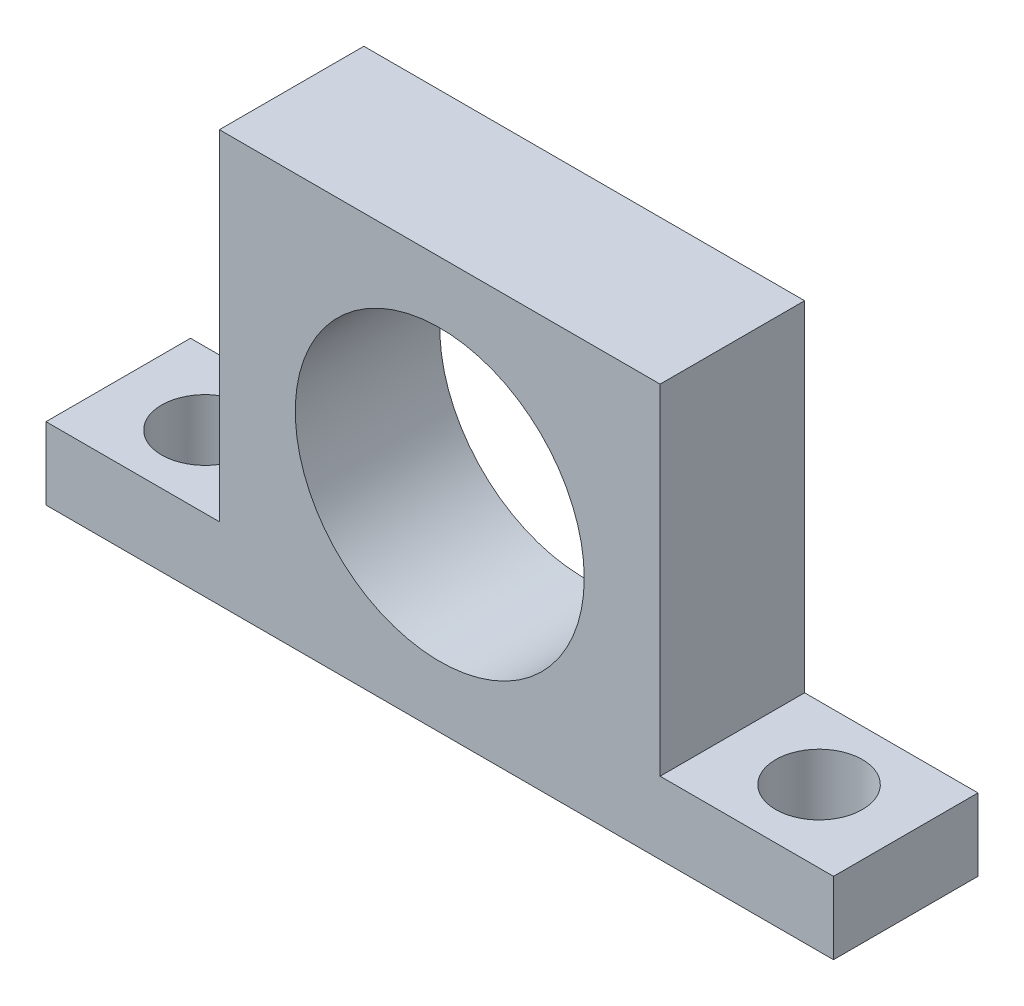
ISO-10303-21;
HEADER;
FILE_DESCRIPTION(('STEP AP214'),'2;1');
FILE_NAME('part.step','',(''),(''),'','','');
FILE_SCHEMA(('AUTOMOTIVE_DESIGN { 1 0 10303 214 1 1 1 1 }'));
ENDSEC;
DATA;
#1=APPLICATION_CONTEXT('core data for automotive mechanical design processes');
#2=APPLICATION_PROTOCOL_DEFINITION('international standard','automotive_design',2000,#1);
#3=PRODUCT_CONTEXT('',#1,'mechanical');
#4=PRODUCT('Part','Part','',(#3));
#5=PRODUCT_RELATED_PRODUCT_CATEGORY('part','',(#4));
#6=PRODUCT_DEFINITION_FORMATION('','',#4);
#7=PRODUCT_DEFINITION_CONTEXT('part definition',#1,'design');
#8=PRODUCT_DEFINITION('design','',#6,#7);
#9=PRODUCT_DEFINITION_SHAPE('','',#8);
#10=(LENGTH_UNIT() NAMED_UNIT(*) SI_UNIT(.MILLI.,.METRE.));
#11=(NAMED_UNIT(*) PLANE_ANGLE_UNIT() SI_UNIT($,.RADIAN.));
#12=(NAMED_UNIT(*) SI_UNIT($,.STERADIAN.) SOLID_ANGLE_UNIT());
#13=UNCERTAINTY_MEASURE_WITH_UNIT(LENGTH_MEASURE(1.E-05),#10,'distance_accuracy_value','');
#14=(GEOMETRIC_REPRESENTATION_CONTEXT(3) GLOBAL_UNCERTAINTY_ASSIGNED_CONTEXT((#13)) GLOBAL_UNIT_ASSIGNED_CONTEXT((#10,
#11,#12)) REPRESENTATION_CONTEXT('',''));
#15=CARTESIAN_POINT('',(0.,0.,0.));
#16=DIRECTION('',(0.,0.,1.));
#17=DIRECTION('',(1.,0.,0.));
#18=AXIS2_PLACEMENT_3D('',#15,#16,#17);
#19=CARTESIAN_POINT('',(-25.15,0.,10.));
#20=DIRECTION('',(1.,0.,0.));
#21=DIRECTION('',(0.,1.,0.));
#22=AXIS2_PLACEMENT_3D('',#19,#20,#21);
#23=PLANE('',#22);
#24=DIRECTION('',(0.,-1.,0.));
#25=VECTOR('',#24,1.);
#26=CARTESIAN_POINT('',(-25.15,0.,0.));
#27=LINE('',#26,#25);
#28=CARTESIAN_POINT('',(-25.15,-16.2,0.));
#29=VERTEX_POINT('',#28);
#30=CARTESIAN_POINT('',(-25.15,-21.2,0.));
#31=VERTEX_POINT('',#30);
#32=EDGE_CURVE('E145',#29,#31,#27,.T.);
#33=ORIENTED_EDGE('',*,*,#32,.T.);
#34=DIRECTION('',(0.,0.,-1.));
#35=VECTOR('',#34,1.);
#36=CARTESIAN_POINT('',(-25.15,-21.2,10.));
#37=LINE('',#36,#35);
#38=CARTESIAN_POINT('',(-25.15,-21.2,10.));
#39=VERTEX_POINT('',#38);
#40=EDGE_CURVE('E11',#39,#31,#37,.T.);
#41=ORIENTED_EDGE('',*,*,#40,.F.);
#42=DIRECTION('',(0.,-1.,0.));
#43=VECTOR('',#42,1.);
#44=CARTESIAN_POINT('',(-25.15,0.,10.));
#45=LINE('',#44,#43);
#46=CARTESIAN_POINT('',(-25.15,-16.2,10.));
#47=VERTEX_POINT('',#46);
#48=EDGE_CURVE('E168',#47,#39,#45,.T.);
#49=ORIENTED_EDGE('',*,*,#48,.F.);
#50=DIRECTION('',(0.,0.,-1.));
#51=VECTOR('',#50,1.);
#52=CARTESIAN_POINT('',(-25.15,-16.2,10.));
#53=LINE('',#52,#51);
#54=EDGE_CURVE('E59',#47,#29,#53,.T.);
#55=ORIENTED_EDGE('',*,*,#54,.T.);
#56=EDGE_LOOP('',(#33,#41,#49,#55));
#57=FACE_BOUND('',#56,.T.);
#58=ADVANCED_FACE('F41',(#57),#23,.F.);
#59=CARTESIAN_POINT('',(0.,-21.2,10.));
#60=DIRECTION('',(0.,1.,0.));
#61=DIRECTION('',(-1.,0.,0.));
#62=AXIS2_PLACEMENT_3D('',#59,#60,#61);
#63=PLANE('',#62);
#64=CARTESIAN_POINT('',(-19.15,-21.2,5.));
#65=DIRECTION('',(0.,1.,0.));
#66=DIRECTION('',(-1.,0.,0.));
#67=AXIS2_PLACEMENT_3D('',#64,#65,#66);
#68=CIRCLE('',#67,3.);
#69=CARTESIAN_POINT('',(-22.15,-21.2,5.));
#70=VERTEX_POINT('',#69);
#71=EDGE_CURVE('E178',#70,#70,#68,.T.);
#72=ORIENTED_EDGE('',*,*,#71,.T.);
#73=EDGE_LOOP('',(#72));
#74=FACE_BOUND('',#73,.T.);
#75=CARTESIAN_POINT('',(23.35,-21.2,4.99999999999999));
#76=DIRECTION('',(0.,1.,0.));
#77=DIRECTION('',(1.,0.,0.));
#78=AXIS2_PLACEMENT_3D('',#75,#76,#77);
#79=CIRCLE('',#78,3.);
#80=CARTESIAN_POINT('',(26.35,-21.2,4.99999999999999));
#81=VERTEX_POINT('',#80);
#82=EDGE_CURVE('E183',#81,#81,#79,.T.);
#83=ORIENTED_EDGE('',*,*,#82,.T.);
#84=EDGE_LOOP('',(#83));
#85=FACE_BOUND('',#84,.T.);
#86=DIRECTION('',(1.,0.,0.));
#87=VECTOR('',#86,1.);
#88=CARTESIAN_POINT('',(0.,-21.2,0.));
#89=LINE('',#88,#87);
#90=CARTESIAN_POINT('',(29.35,-21.2,0.));
#91=VERTEX_POINT('',#90);
#92=EDGE_CURVE('E147',#31,#91,#89,.T.);
#93=ORIENTED_EDGE('',*,*,#92,.T.);
#94=DIRECTION('',(0.,0.,-1.));
#95=VECTOR('',#94,1.);
#96=CARTESIAN_POINT('',(29.35,-21.2,10.));
#97=LINE('',#96,#95);
#98=CARTESIAN_POINT('',(29.35,-21.2,10.));
#99=VERTEX_POINT('',#98);
#100=EDGE_CURVE('E50',#99,#91,#97,.T.);
#101=ORIENTED_EDGE('',*,*,#100,.F.);
#102=DIRECTION('',(1.,0.,0.));
#103=VECTOR('',#102,1.);
#104=CARTESIAN_POINT('',(0.,-21.2,10.));
#105=LINE('',#104,#103);
#106=EDGE_CURVE('E98',#39,#99,#105,.T.);
#107=ORIENTED_EDGE('',*,*,#106,.F.);
#108=ORIENTED_EDGE('',*,*,#40,.T.);
#109=EDGE_LOOP('',(#93,#101,#107,#108));
#110=FACE_BOUND('',#109,.T.);
#111=ADVANCED_FACE('F219',(#74,#85,#110),#63,.F.);
#112=CARTESIAN_POINT('',(29.35,0.,10.));
#113=DIRECTION('',(1.,0.,0.));
#114=DIRECTION('',(0.,1.,0.));
#115=AXIS2_PLACEMENT_3D('',#112,#113,#114);
#116=PLANE('',#115);
#117=DIRECTION('',(0.,-1.,0.));
#118=VECTOR('',#117,1.);
#119=CARTESIAN_POINT('',(29.35,0.,0.));
#120=LINE('',#119,#118);
#121=CARTESIAN_POINT('',(29.35,-16.2,0.));
#122=VERTEX_POINT('',#121);
#123=EDGE_CURVE('E150',#122,#91,#120,.T.);
#124=ORIENTED_EDGE('',*,*,#123,.F.);
#125=DIRECTION('',(0.,0.,-1.));
#126=VECTOR('',#125,1.);
#127=CARTESIAN_POINT('',(29.35,-16.2,10.));
#128=LINE('',#127,#126);
#129=CARTESIAN_POINT('',(29.35,-16.2,10.));
#130=VERTEX_POINT('',#129);
#131=EDGE_CURVE('E174',#130,#122,#128,.T.);
#132=ORIENTED_EDGE('',*,*,#131,.F.);
#133=DIRECTION('',(0.,-1.,0.));
#134=VECTOR('',#133,1.);
#135=CARTESIAN_POINT('',(29.35,0.,10.));
#136=LINE('',#135,#134);
#137=EDGE_CURVE('E192',#130,#99,#136,.T.);
#138=ORIENTED_EDGE('',*,*,#137,.T.);
#139=ORIENTED_EDGE('',*,*,#100,.T.);
#140=EDGE_LOOP('',(#124,#132,#138,#139));
#141=FACE_BOUND('',#140,.T.);
#142=ADVANCED_FACE('F223',(#141),#116,.T.);
#143=CARTESIAN_POINT('',(0.,-16.2,10.));
#144=DIRECTION('',(0.,-1.,0.));
#145=DIRECTION('',(1.,0.,0.));
#146=AXIS2_PLACEMENT_3D('',#143,#144,#145);
#147=PLANE('',#146);
#148=CARTESIAN_POINT('',(23.35,-16.2,4.99999999999999));
#149=DIRECTION('',(0.,-1.,0.));
#150=DIRECTION('',(1.,0.,0.));
#151=AXIS2_PLACEMENT_3D('',#148,#149,#150);
#152=CIRCLE('',#151,3.);
#153=CARTESIAN_POINT('',(26.35,-16.2,4.99999999999999));
#154=VERTEX_POINT('',#153);
#155=EDGE_CURVE('E44',#154,#154,#152,.T.);
#156=ORIENTED_EDGE('',*,*,#155,.T.);
#157=EDGE_LOOP('',(#156));
#158=FACE_BOUND('',#157,.T.);
#159=DIRECTION('',(-1.,0.,0.));
#160=VECTOR('',#159,1.);
#161=CARTESIAN_POINT('',(0.,-16.2,0.));
#162=LINE('',#161,#160);
#163=CARTESIAN_POINT('',(17.35,-16.2,0.));
#164=VERTEX_POINT('',#163);
#165=EDGE_CURVE('E153',#122,#164,#162,.T.);
#166=ORIENTED_EDGE('',*,*,#165,.T.);
#167=DIRECTION('',(0.,0.,-1.));
#168=VECTOR('',#167,1.);
#169=CARTESIAN_POINT('',(17.35,-16.2,10.));
#170=LINE('',#169,#168);
#171=CARTESIAN_POINT('',(17.35,-16.2,10.));
#172=VERTEX_POINT('',#171);
#173=EDGE_CURVE('E172',#172,#164,#170,.T.);
#174=ORIENTED_EDGE('',*,*,#173,.F.);
#175=DIRECTION('',(-1.,0.,0.));
#176=VECTOR('',#175,1.);
#177=CARTESIAN_POINT('',(0.,-16.2,10.));
#178=LINE('',#177,#176);
#179=EDGE_CURVE('E137',#130,#172,#178,.T.);
#180=ORIENTED_EDGE('',*,*,#179,.F.);
#181=ORIENTED_EDGE('',*,*,#131,.T.);
#182=EDGE_LOOP('',(#166,#174,#180,#181));
#183=FACE_BOUND('',#182,.T.);
#184=ADVANCED_FACE('F198',(#158,#183),#147,.F.);
#185=CARTESIAN_POINT('',(17.35,0.,10.));
#186=DIRECTION('',(1.,0.,0.));
#187=DIRECTION('',(0.,1.,0.));
#188=AXIS2_PLACEMENT_3D('',#185,#186,#187);
#189=PLANE('',#188);
#190=DIRECTION('',(0.,-1.,0.));
#191=VECTOR('',#190,1.);
#192=CARTESIAN_POINT('',(17.35,0.,0.));
#193=LINE('',#192,#191);
#194=CARTESIAN_POINT('',(17.35,7.30000000000001,0.));
#195=VERTEX_POINT('',#194);
#196=EDGE_CURVE('E156',#195,#164,#193,.T.);
#197=ORIENTED_EDGE('',*,*,#196,.F.);
#198=DIRECTION('',(0.,0.,-1.));
#199=VECTOR('',#198,1.);
#200=CARTESIAN_POINT('',(17.35,7.30000000000001,10.));
#201=LINE('',#200,#199);
#202=CARTESIAN_POINT('',(17.35,7.30000000000001,10.));
#203=VERTEX_POINT('',#202);
#204=EDGE_CURVE('E123',#203,#195,#201,.T.);
#205=ORIENTED_EDGE('',*,*,#204,.F.);
#206=DIRECTION('',(0.,-1.,0.));
#207=VECTOR('',#206,1.);
#208=CARTESIAN_POINT('',(17.35,0.,10.));
#209=LINE('',#208,#207);
#210=EDGE_CURVE('E135',#203,#172,#209,.T.);
#211=ORIENTED_EDGE('',*,*,#210,.T.);
#212=ORIENTED_EDGE('',*,*,#173,.T.);
#213=EDGE_LOOP('',(#197,#205,#211,#212));
#214=FACE_BOUND('',#213,.T.);
#215=ADVANCED_FACE('F202',(#214),#189,.T.);
#216=CARTESIAN_POINT('',(0.,7.3,10.));
#217=DIRECTION('',(0.,1.,0.));
#218=DIRECTION('',(-1.,0.,0.));
#219=AXIS2_PLACEMENT_3D('',#216,#217,#218);
#220=PLANE('',#219);
#221=DIRECTION('',(1.,0.,0.));
#222=VECTOR('',#221,1.);
#223=CARTESIAN_POINT('',(0.,7.3,0.));
#224=LINE('',#223,#222);
#225=CARTESIAN_POINT('',(-13.15,7.3,0.));
#226=VERTEX_POINT('',#225);
#227=EDGE_CURVE('E120',#226,#195,#224,.T.);
#228=ORIENTED_EDGE('',*,*,#227,.F.);
#229=DIRECTION('',(0.,0.,-1.));
#230=VECTOR('',#229,1.);
#231=CARTESIAN_POINT('',(-13.15,7.3,10.));
#232=LINE('',#231,#230);
#233=CARTESIAN_POINT('',(-13.15,7.3,10.));
#234=VERTEX_POINT('',#233);
#235=EDGE_CURVE('E114',#234,#226,#232,.T.);
#236=ORIENTED_EDGE('',*,*,#235,.F.);
#237=DIRECTION('',(1.,0.,0.));
#238=VECTOR('',#237,1.);
#239=CARTESIAN_POINT('',(0.,7.3,10.));
#240=LINE('',#239,#238);
#241=EDGE_CURVE('E118',#234,#203,#240,.T.);
#242=ORIENTED_EDGE('',*,*,#241,.T.);
#243=ORIENTED_EDGE('',*,*,#204,.T.);
#244=EDGE_LOOP('',(#228,#236,#242,#243));
#245=FACE_BOUND('',#244,.T.);
#246=ADVANCED_FACE('F116',(#245),#220,.T.);
#247=CARTESIAN_POINT('',(-13.15,0.,10.));
#248=DIRECTION('',(1.,0.,0.));
#249=DIRECTION('',(0.,1.,0.));
#250=AXIS2_PLACEMENT_3D('',#247,#248,#249);
#251=PLANE('',#250);
#252=DIRECTION('',(0.,-1.,0.));
#253=VECTOR('',#252,1.);
#254=CARTESIAN_POINT('',(-13.15,0.,0.));
#255=LINE('',#254,#253);
#256=CARTESIAN_POINT('',(-13.15,-16.2,0.));
#257=VERTEX_POINT('',#256);
#258=EDGE_CURVE('E160',#226,#257,#255,.T.);
#259=ORIENTED_EDGE('',*,*,#258,.T.);
#260=DIRECTION('',(0.,0.,-1.));
#261=VECTOR('',#260,1.);
#262=CARTESIAN_POINT('',(-13.15,-16.2,10.));
#263=LINE('',#262,#261);
#264=CARTESIAN_POINT('',(-13.15,-16.2,10.));
#265=VERTEX_POINT('',#264);
#266=EDGE_CURVE('E86',#265,#257,#263,.T.);
#267=ORIENTED_EDGE('',*,*,#266,.F.);
#268=DIRECTION('',(0.,-1.,0.));
#269=VECTOR('',#268,1.);
#270=CARTESIAN_POINT('',(-13.15,0.,10.));
#271=LINE('',#270,#269);
#272=EDGE_CURVE('E125',#234,#265,#271,.T.);
#273=ORIENTED_EDGE('',*,*,#272,.F.);
#274=ORIENTED_EDGE('',*,*,#235,.T.);
#275=EDGE_LOOP('',(#259,#267,#273,#274));
#276=FACE_BOUND('',#275,.T.);
#277=ADVANCED_FACE('F126',(#276),#251,.F.);
#278=CARTESIAN_POINT('',(0.,-16.2,10.));
#279=DIRECTION('',(0.,1.,0.));
#280=DIRECTION('',(0.,0.,1.));
#281=AXIS2_PLACEMENT_3D('',#278,#279,#280);
#282=PLANE('',#281);
#283=CARTESIAN_POINT('',(-19.15,-16.2,5.));
#284=DIRECTION('',(0.,1.,0.));
#285=DIRECTION('',(0.,0.,1.));
#286=AXIS2_PLACEMENT_3D('',#283,#284,#285);
#287=CIRCLE('',#286,3.);
#288=CARTESIAN_POINT('',(-19.15,-16.2,8.));
#289=VERTEX_POINT('',#288);
#290=EDGE_CURVE('E176',#289,#289,#287,.T.);
#291=ORIENTED_EDGE('',*,*,#290,.F.);
#292=EDGE_LOOP('',(#291));
#293=FACE_BOUND('',#292,.T.);
#294=DIRECTION('',(1.,0.,0.));
#295=VECTOR('',#294,1.);
#296=CARTESIAN_POINT('',(0.,-16.2,0.));
#297=LINE('',#296,#295);
#298=EDGE_CURVE('E162',#29,#257,#297,.T.);
#299=ORIENTED_EDGE('',*,*,#298,.F.);
#300=ORIENTED_EDGE('',*,*,#54,.F.);
#301=DIRECTION('',(1.,0.,0.));
#302=VECTOR('',#301,1.);
#303=CARTESIAN_POINT('',(0.,-16.2,10.));
#304=LINE('',#303,#302);
#305=EDGE_CURVE('E129',#47,#265,#304,.T.);
#306=ORIENTED_EDGE('',*,*,#305,.T.);
#307=ORIENTED_EDGE('',*,*,#266,.T.);
#308=EDGE_LOOP('',(#299,#300,#306,#307));
#309=FACE_BOUND('',#308,.T.);
#310=ADVANCED_FACE('F206',(#293,#309),#282,.T.);
#311=CARTESIAN_POINT('',(2.1,-6.95,10.));
#312=DIRECTION('',(0.,0.,-1.));
#313=DIRECTION('',(-1.,0.,0.));
#314=AXIS2_PLACEMENT_3D('',#311,#312,#313);
#315=CYLINDRICAL_SURFACE('',#314,10.);
#316=CARTESIAN_POINT('',(2.1,-6.95,10.));
#317=DIRECTION('',(0.,0.,1.));
#318=DIRECTION('',(1.,0.,0.));
#319=AXIS2_PLACEMENT_3D('',#316,#317,#318);
#320=CIRCLE('',#319,10.);
#321=CARTESIAN_POINT('',(12.1,-6.95,10.));
#322=VERTEX_POINT('',#321);
#323=EDGE_CURVE('E142',#322,#322,#320,.T.);
#324=ORIENTED_EDGE('',*,*,#323,.T.);
#325=EDGE_LOOP('',(#324));
#326=FACE_BOUND('',#325,.T.);
#327=CARTESIAN_POINT('',(2.1,-6.95,0.));
#328=DIRECTION('',(0.,0.,1.));
#329=DIRECTION('',(1.,0.,0.));
#330=AXIS2_PLACEMENT_3D('',#327,#328,#329);
#331=CIRCLE('',#330,10.);
#332=CARTESIAN_POINT('',(12.1,-6.95,0.));
#333=VERTEX_POINT('',#332);
#334=EDGE_CURVE('E165',#333,#333,#331,.T.);
#335=ORIENTED_EDGE('',*,*,#334,.F.);
#336=EDGE_LOOP('',(#335));
#337=FACE_BOUND('',#336,.T.);
#338=ADVANCED_FACE('F208',(#326,#337),#315,.F.);
#339=CARTESIAN_POINT('',(0.,0.,10.));
#340=DIRECTION('',(0.,0.,1.));
#341=DIRECTION('',(1.,0.,0.));
#342=AXIS2_PLACEMENT_3D('',#339,#340,#341);
#343=PLANE('',#342);
#344=ORIENTED_EDGE('',*,*,#48,.T.);
#345=ORIENTED_EDGE('',*,*,#106,.T.);
#346=ORIENTED_EDGE('',*,*,#137,.F.);
#347=ORIENTED_EDGE('',*,*,#179,.T.);
#348=ORIENTED_EDGE('',*,*,#210,.F.);
#349=ORIENTED_EDGE('',*,*,#241,.F.);
#350=ORIENTED_EDGE('',*,*,#272,.T.);
#351=ORIENTED_EDGE('',*,*,#305,.F.);
#352=EDGE_LOOP('',(#344,#345,#346,#347,#348,#349,#350,#351));
#353=FACE_BOUND('',#352,.T.);
#354=ORIENTED_EDGE('',*,*,#323,.F.);
#355=EDGE_LOOP('',(#354));
#356=FACE_BOUND('',#355,.T.);
#357=ADVANCED_FACE('F132',(#353,#356),#343,.T.);
#358=CARTESIAN_POINT('',(0.,0.,0.));
#359=DIRECTION('',(0.,0.,1.));
#360=DIRECTION('',(1.,0.,0.));
#361=AXIS2_PLACEMENT_3D('',#358,#359,#360);
#362=PLANE('',#361);
#363=ORIENTED_EDGE('',*,*,#32,.F.);
#364=ORIENTED_EDGE('',*,*,#298,.T.);
#365=ORIENTED_EDGE('',*,*,#258,.F.);
#366=ORIENTED_EDGE('',*,*,#227,.T.);
#367=ORIENTED_EDGE('',*,*,#196,.T.);
#368=ORIENTED_EDGE('',*,*,#165,.F.);
#369=ORIENTED_EDGE('',*,*,#123,.T.);
#370=ORIENTED_EDGE('',*,*,#92,.F.);
#371=EDGE_LOOP('',(#363,#364,#365,#366,#367,#368,#369,#370));
#372=FACE_BOUND('',#371,.T.);
#373=ORIENTED_EDGE('',*,*,#334,.T.);
#374=EDGE_LOOP('',(#373));
#375=FACE_BOUND('',#374,.T.);
#376=ADVANCED_FACE('F204',(#372,#375),#362,.F.);
#377=CARTESIAN_POINT('',(-19.15,-21.2,5.));
#378=DIRECTION('',(0.,1.,0.));
#379=DIRECTION('',(-1.,0.,0.));
#380=AXIS2_PLACEMENT_3D('',#377,#378,#379);
#381=CYLINDRICAL_SURFACE('',#380,3.);
#382=ORIENTED_EDGE('',*,*,#290,.T.);
#383=EDGE_LOOP('',(#382));
#384=FACE_BOUND('',#383,.T.);
#385=ORIENTED_EDGE('',*,*,#71,.F.);
#386=EDGE_LOOP('',(#385));
#387=FACE_BOUND('',#386,.T.);
#388=ADVANCED_FACE('F273',(#384,#387),#381,.F.);
#389=CARTESIAN_POINT('',(23.35,-21.2,4.99999999999999));
#390=DIRECTION('',(0.,1.,0.));
#391=DIRECTION('',(-1.,0.,0.));
#392=AXIS2_PLACEMENT_3D('',#389,#390,#391);
#393=CYLINDRICAL_SURFACE('',#392,3.);
#394=ORIENTED_EDGE('',*,*,#82,.F.);
#395=EDGE_LOOP('',(#394));
#396=FACE_BOUND('',#395,.T.);
#397=ORIENTED_EDGE('',*,*,#155,.F.);
#398=EDGE_LOOP('',(#397));
#399=FACE_BOUND('',#398,.T.);
#400=ADVANCED_FACE('F304',(#396,#399),#393,.F.);
#401=CLOSED_SHELL('',(#58,#111,#142,#184,#215,#246,#277,#310,#338,#357,#376,#388,#400));
#402=MANIFOLD_SOLID_BREP('B2',#401);
#403=ADVANCED_BREP_SHAPE_REPRESENTATION('',(#18,#402),#14);
#404=SHAPE_DEFINITION_REPRESENTATION(#9,#403);
ENDSEC;
END-ISO-10303-21;
